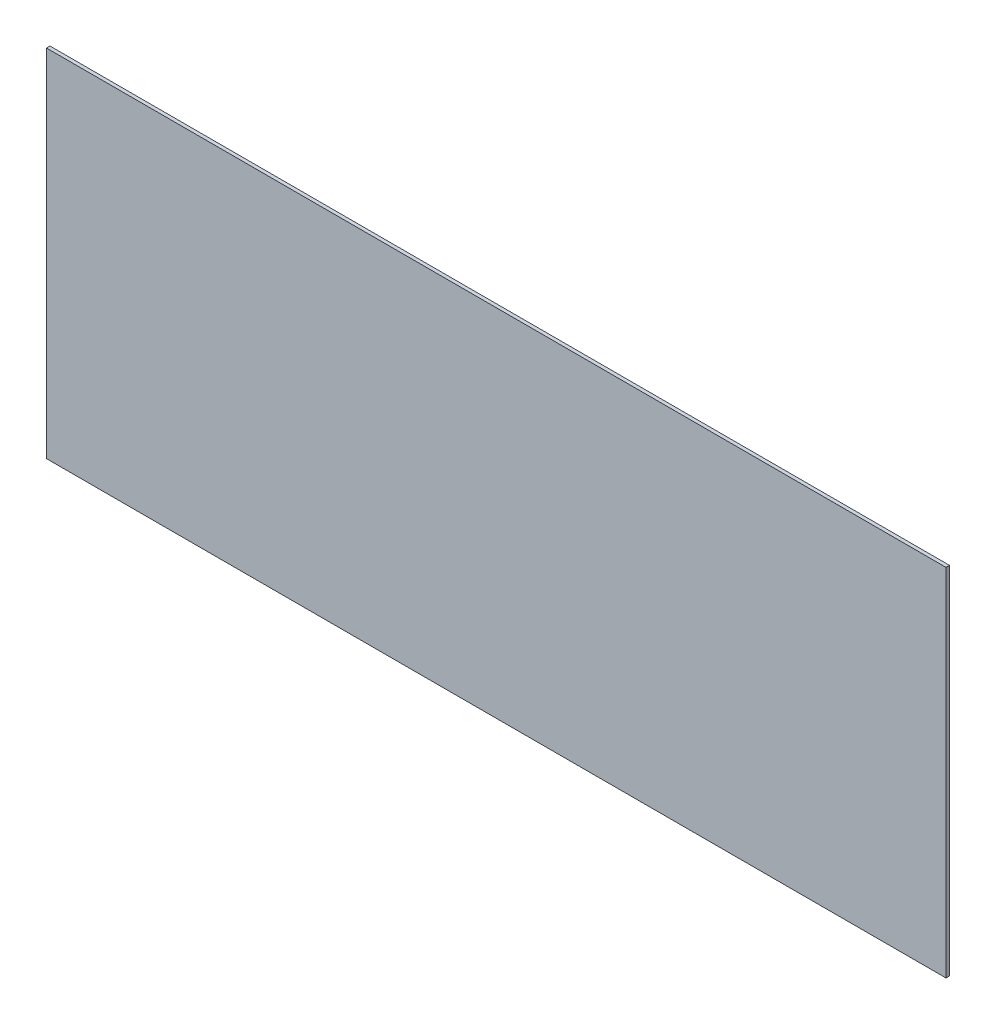
ISO-10303-21;
HEADER;
FILE_DESCRIPTION(('STEP AP214'),'2;1');
FILE_NAME('part.step','',(''),(''),'','','');
FILE_SCHEMA(('AUTOMOTIVE_DESIGN { 1 0 10303 214 1 1 1 1 }'));
ENDSEC;
DATA;
#1=APPLICATION_CONTEXT('core data for automotive mechanical design processes');
#2=APPLICATION_PROTOCOL_DEFINITION('international standard','automotive_design',2000,#1);
#3=PRODUCT_CONTEXT('',#1,'mechanical');
#4=PRODUCT('Part','Part','',(#3));
#5=PRODUCT_RELATED_PRODUCT_CATEGORY('part','',(#4));
#6=PRODUCT_DEFINITION_FORMATION('','',#4);
#7=PRODUCT_DEFINITION_CONTEXT('part definition',#1,'design');
#8=PRODUCT_DEFINITION('design','',#6,#7);
#9=PRODUCT_DEFINITION_SHAPE('','',#8);
#10=(LENGTH_UNIT() NAMED_UNIT(*) SI_UNIT(.MILLI.,.METRE.));
#11=(NAMED_UNIT(*) PLANE_ANGLE_UNIT() SI_UNIT($,.RADIAN.));
#12=(NAMED_UNIT(*) SI_UNIT($,.STERADIAN.) SOLID_ANGLE_UNIT());
#13=UNCERTAINTY_MEASURE_WITH_UNIT(LENGTH_MEASURE(1.E-05),#10,'distance_accuracy_value','');
#14=(GEOMETRIC_REPRESENTATION_CONTEXT(3) GLOBAL_UNCERTAINTY_ASSIGNED_CONTEXT((#13)) GLOBAL_UNIT_ASSIGNED_CONTEXT((#10,
#11,#12)) REPRESENTATION_CONTEXT('',''));
#15=CARTESIAN_POINT('',(0.,0.,0.));
#16=DIRECTION('',(0.,0.,1.));
#17=DIRECTION('',(1.,0.,0.));
#18=AXIS2_PLACEMENT_3D('',#15,#16,#17);
#19=CARTESIAN_POINT('',(-64.5,-25.5,0.5));
#20=DIRECTION('',(1.,0.,0.));
#21=DIRECTION('',(0.,0.,-1.));
#22=AXIS2_PLACEMENT_3D('',#19,#20,#21);
#23=PLANE('',#22);
#24=DIRECTION('',(0.,-1.,0.));
#25=VECTOR('',#24,1.);
#26=CARTESIAN_POINT('',(-64.5,-25.5,0.));
#27=LINE('',#26,#25);
#28=CARTESIAN_POINT('',(-64.5,25.5,0.));
#29=VERTEX_POINT('',#28);
#30=CARTESIAN_POINT('',(-64.5,-25.5,0.));
#31=VERTEX_POINT('',#30);
#32=EDGE_CURVE('E96',#29,#31,#27,.T.);
#33=ORIENTED_EDGE('',*,*,#32,.T.);
#34=DIRECTION('',(0.,0.,-1.));
#35=VECTOR('',#34,1.);
#36=CARTESIAN_POINT('',(-64.5,-25.5,0.5));
#37=LINE('',#36,#35);
#38=CARTESIAN_POINT('',(-64.5,-25.5,0.5));
#39=VERTEX_POINT('',#38);
#40=EDGE_CURVE('E11',#39,#31,#37,.T.);
#41=ORIENTED_EDGE('',*,*,#40,.F.);
#42=DIRECTION('',(0.,-1.,0.));
#43=VECTOR('',#42,1.);
#44=CARTESIAN_POINT('',(-64.5,-25.5,0.5));
#45=LINE('',#44,#43);
#46=CARTESIAN_POINT('',(-64.5,25.5,0.5));
#47=VERTEX_POINT('',#46);
#48=EDGE_CURVE('E84',#47,#39,#45,.T.);
#49=ORIENTED_EDGE('',*,*,#48,.F.);
#50=DIRECTION('',(0.,0.,-1.));
#51=VECTOR('',#50,1.);
#52=CARTESIAN_POINT('',(-64.5,25.5,0.5));
#53=LINE('',#52,#51);
#54=EDGE_CURVE('E92',#47,#29,#53,.T.);
#55=ORIENTED_EDGE('',*,*,#54,.T.);
#56=EDGE_LOOP('',(#33,#41,#49,#55));
#57=FACE_BOUND('',#56,.T.);
#58=ADVANCED_FACE('F33',(#57),#23,.F.);
#59=CARTESIAN_POINT('',(64.5,-25.5,0.5));
#60=DIRECTION('',(0.,1.,0.));
#61=DIRECTION('',(-1.,0.,0.));
#62=AXIS2_PLACEMENT_3D('',#59,#60,#61);
#63=PLANE('',#62);
#64=DIRECTION('',(1.,0.,0.));
#65=VECTOR('',#64,1.);
#66=CARTESIAN_POINT('',(64.5,-25.5,0.));
#67=LINE('',#66,#65);
#68=CARTESIAN_POINT('',(64.5,-25.5,0.));
#69=VERTEX_POINT('',#68);
#70=EDGE_CURVE('E88',#31,#69,#67,.T.);
#71=ORIENTED_EDGE('',*,*,#70,.T.);
#72=DIRECTION('',(0.,0.,-1.));
#73=VECTOR('',#72,1.);
#74=CARTESIAN_POINT('',(64.5,-25.5,0.5));
#75=LINE('',#74,#73);
#76=CARTESIAN_POINT('',(64.5,-25.5,0.5));
#77=VERTEX_POINT('',#76);
#78=EDGE_CURVE('E41',#77,#69,#75,.T.);
#79=ORIENTED_EDGE('',*,*,#78,.F.);
#80=DIRECTION('',(1.,0.,0.));
#81=VECTOR('',#80,1.);
#82=CARTESIAN_POINT('',(64.5,-25.5,0.5));
#83=LINE('',#82,#81);
#84=EDGE_CURVE('E79',#39,#77,#83,.T.);
#85=ORIENTED_EDGE('',*,*,#84,.F.);
#86=ORIENTED_EDGE('',*,*,#40,.T.);
#87=EDGE_LOOP('',(#71,#79,#85,#86));
#88=FACE_BOUND('',#87,.T.);
#89=ADVANCED_FACE('F87',(#88),#63,.F.);
#90=CARTESIAN_POINT('',(64.5,-25.5,0.5));
#91=DIRECTION('',(-1.,0.,0.));
#92=DIRECTION('',(0.,0.,1.));
#93=AXIS2_PLACEMENT_3D('',#90,#91,#92);
#94=PLANE('',#93);
#95=DIRECTION('',(0.,1.,0.));
#96=VECTOR('',#95,1.);
#97=CARTESIAN_POINT('',(64.5,-25.5,0.));
#98=LINE('',#97,#96);
#99=CARTESIAN_POINT('',(64.5,25.5,0.));
#100=VERTEX_POINT('',#99);
#101=EDGE_CURVE('E66',#69,#100,#98,.T.);
#102=ORIENTED_EDGE('',*,*,#101,.T.);
#103=DIRECTION('',(0.,0.,-1.));
#104=VECTOR('',#103,1.);
#105=CARTESIAN_POINT('',(64.5,25.5,0.5));
#106=LINE('',#105,#104);
#107=CARTESIAN_POINT('',(64.5,25.5,0.5));
#108=VERTEX_POINT('',#107);
#109=EDGE_CURVE('E89',#108,#100,#106,.T.);
#110=ORIENTED_EDGE('',*,*,#109,.F.);
#111=DIRECTION('',(0.,1.,0.));
#112=VECTOR('',#111,1.);
#113=CARTESIAN_POINT('',(64.5,-25.5,0.5));
#114=LINE('',#113,#112);
#115=EDGE_CURVE('E82',#77,#108,#114,.T.);
#116=ORIENTED_EDGE('',*,*,#115,.F.);
#117=ORIENTED_EDGE('',*,*,#78,.T.);
#118=EDGE_LOOP('',(#102,#110,#116,#117));
#119=FACE_BOUND('',#118,.T.);
#120=ADVANCED_FACE('F90',(#119),#94,.F.);
#121=CARTESIAN_POINT('',(64.5,25.5,0.5));
#122=DIRECTION('',(0.,-1.,0.));
#123=DIRECTION('',(1.,0.,0.));
#124=AXIS2_PLACEMENT_3D('',#121,#122,#123);
#125=PLANE('',#124);
#126=DIRECTION('',(-1.,0.,0.));
#127=VECTOR('',#126,1.);
#128=CARTESIAN_POINT('',(64.5,25.5,0.));
#129=LINE('',#128,#127);
#130=EDGE_CURVE('E72',#100,#29,#129,.T.);
#131=ORIENTED_EDGE('',*,*,#130,.T.);
#132=ORIENTED_EDGE('',*,*,#54,.F.);
#133=DIRECTION('',(-1.,0.,0.));
#134=VECTOR('',#133,1.);
#135=CARTESIAN_POINT('',(64.5,25.5,0.5));
#136=LINE('',#135,#134);
#137=EDGE_CURVE('E49',#108,#47,#136,.T.);
#138=ORIENTED_EDGE('',*,*,#137,.F.);
#139=ORIENTED_EDGE('',*,*,#109,.T.);
#140=EDGE_LOOP('',(#131,#132,#138,#139));
#141=FACE_BOUND('',#140,.T.);
#142=ADVANCED_FACE('F103',(#141),#125,.F.);
#143=CARTESIAN_POINT('',(0.,0.,0.5));
#144=DIRECTION('',(0.,0.,1.));
#145=DIRECTION('',(1.,0.,0.));
#146=AXIS2_PLACEMENT_3D('',#143,#144,#145);
#147=PLANE('',#146);
#148=ORIENTED_EDGE('',*,*,#48,.T.);
#149=ORIENTED_EDGE('',*,*,#84,.T.);
#150=ORIENTED_EDGE('',*,*,#115,.T.);
#151=ORIENTED_EDGE('',*,*,#137,.T.);
#152=EDGE_LOOP('',(#148,#149,#150,#151));
#153=FACE_BOUND('',#152,.T.);
#154=ADVANCED_FACE('F80',(#153),#147,.T.);
#155=CARTESIAN_POINT('',(0.,0.,0.));
#156=DIRECTION('',(0.,0.,1.));
#157=DIRECTION('',(1.,0.,0.));
#158=AXIS2_PLACEMENT_3D('',#155,#156,#157);
#159=PLANE('',#158);
#160=ORIENTED_EDGE('',*,*,#32,.F.);
#161=ORIENTED_EDGE('',*,*,#130,.F.);
#162=ORIENTED_EDGE('',*,*,#101,.F.);
#163=ORIENTED_EDGE('',*,*,#70,.F.);
#164=EDGE_LOOP('',(#160,#161,#162,#163));
#165=FACE_BOUND('',#164,.T.);
#166=ADVANCED_FACE('F106',(#165),#159,.F.);
#167=CLOSED_SHELL('',(#58,#89,#120,#142,#154,#166));
#168=MANIFOLD_SOLID_BREP('B2',#167);
#169=ADVANCED_BREP_SHAPE_REPRESENTATION('',(#18,#168),#14);
#170=SHAPE_DEFINITION_REPRESENTATION(#9,#169);
ENDSEC;
END-ISO-10303-21;
